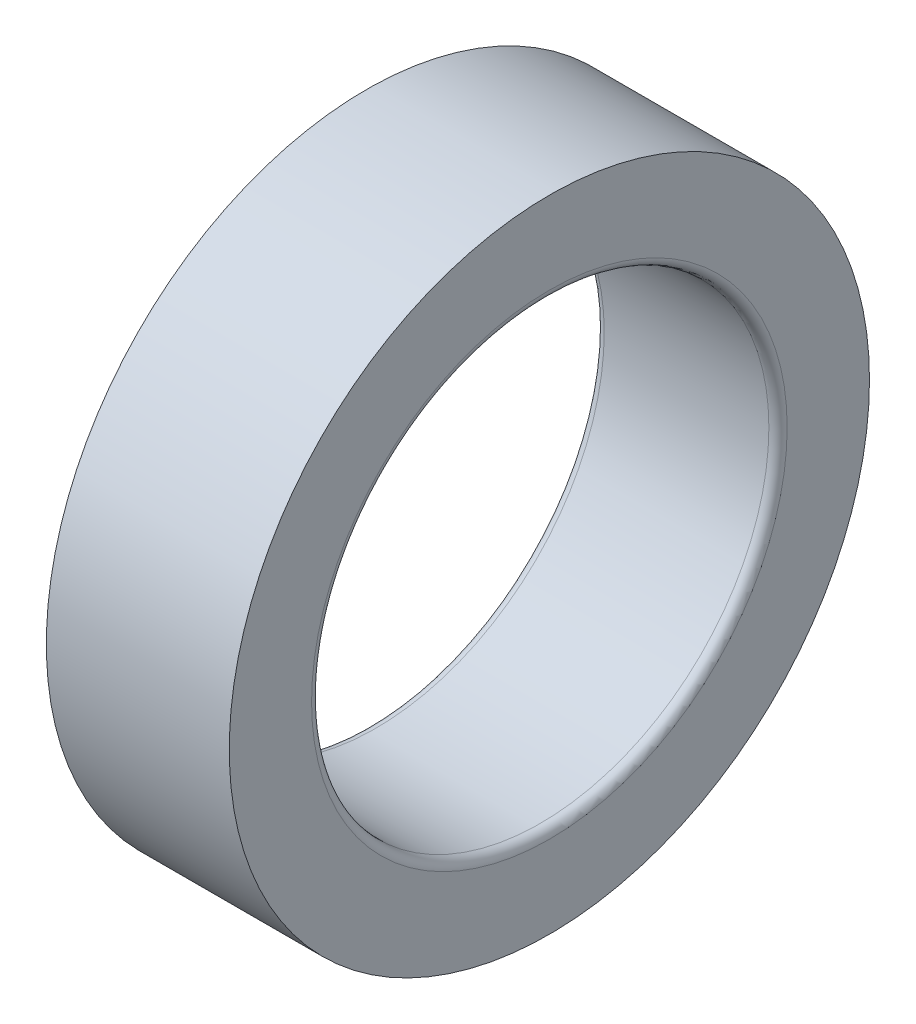
ISO-10303-21;
HEADER;
FILE_DESCRIPTION(('STEP AP214'),'2;1');
FILE_NAME('part.step','',(''),(''),'','','');
FILE_SCHEMA(('AUTOMOTIVE_DESIGN { 1 0 10303 214 1 1 1 1 }'));
ENDSEC;
DATA;
#1=APPLICATION_CONTEXT('core data for automotive mechanical design processes');
#2=APPLICATION_PROTOCOL_DEFINITION('international standard','automotive_design',2000,#1);
#3=PRODUCT_CONTEXT('',#1,'mechanical');
#4=PRODUCT('Part','Part','',(#3));
#5=PRODUCT_RELATED_PRODUCT_CATEGORY('part','',(#4));
#6=PRODUCT_DEFINITION_FORMATION('','',#4);
#7=PRODUCT_DEFINITION_CONTEXT('part definition',#1,'design');
#8=PRODUCT_DEFINITION('design','',#6,#7);
#9=PRODUCT_DEFINITION_SHAPE('','',#8);
#10=(LENGTH_UNIT() NAMED_UNIT(*) SI_UNIT(.MILLI.,.METRE.));
#11=(NAMED_UNIT(*) PLANE_ANGLE_UNIT() SI_UNIT($,.RADIAN.));
#12=(NAMED_UNIT(*) SI_UNIT($,.STERADIAN.) SOLID_ANGLE_UNIT());
#13=UNCERTAINTY_MEASURE_WITH_UNIT(LENGTH_MEASURE(1.E-05),#10,'distance_accuracy_value','');
#14=(GEOMETRIC_REPRESENTATION_CONTEXT(3) GLOBAL_UNCERTAINTY_ASSIGNED_CONTEXT((#13)) GLOBAL_UNIT_ASSIGNED_CONTEXT((#10,
#11,#12)) REPRESENTATION_CONTEXT('',''));
#15=CARTESIAN_POINT('',(0.,0.,0.));
#16=DIRECTION('',(0.,0.,1.));
#17=DIRECTION('',(1.,0.,0.));
#18=AXIS2_PLACEMENT_3D('',#15,#16,#17);
#19=CARTESIAN_POINT('',(20.,0.,0.));
#20=DIRECTION('',(1.,0.,0.));
#21=DIRECTION('',(0.,0.,-1.));
#22=AXIS2_PLACEMENT_3D('',#19,#20,#21);
#23=PLANE('',#22);
#24=CARTESIAN_POINT('',(20.,0.,0.));
#25=DIRECTION('',(1.,0.,0.));
#26=DIRECTION('',(0.,0.,-1.));
#27=AXIS2_PLACEMENT_3D('',#24,#25,#26);
#28=CIRCLE('',#27,26.);
#29=CARTESIAN_POINT('',(20.,0.,-26.));
#30=VERTEX_POINT('',#29);
#31=EDGE_CURVE('E10',#30,#30,#28,.F.);
#32=ORIENTED_EDGE('',*,*,#31,.T.);
#33=EDGE_LOOP('',(#32));
#34=FACE_BOUND('',#33,.T.);
#35=CARTESIAN_POINT('',(20.,0.,0.));
#36=DIRECTION('',(1.,0.,0.));
#37=DIRECTION('',(0.,0.,-1.));
#38=AXIS2_PLACEMENT_3D('',#35,#36,#37);
#39=CIRCLE('',#38,35.);
#40=CARTESIAN_POINT('',(20.,0.,-35.));
#41=VERTEX_POINT('',#40);
#42=EDGE_CURVE('E51',#41,#41,#39,.T.);
#43=ORIENTED_EDGE('',*,*,#42,.T.);
#44=EDGE_LOOP('',(#43));
#45=FACE_BOUND('',#44,.T.);
#46=ADVANCED_FACE('F31',(#34,#45),#23,.T.);
#47=CARTESIAN_POINT('',(0.,0.,0.));
#48=DIRECTION('',(1.,0.,0.));
#49=DIRECTION('',(0.,0.,-1.));
#50=AXIS2_PLACEMENT_3D('',#47,#48,#49);
#51=PLANE('',#50);
#52=CARTESIAN_POINT('',(0.,0.,0.));
#53=DIRECTION('',(1.,0.,0.));
#54=DIRECTION('',(0.,0.,-1.));
#55=AXIS2_PLACEMENT_3D('',#52,#53,#54);
#56=CIRCLE('',#55,26.);
#57=CARTESIAN_POINT('',(0.,0.,-26.));
#58=VERTEX_POINT('',#57);
#59=EDGE_CURVE('E46',#58,#58,#56,.T.);
#60=ORIENTED_EDGE('',*,*,#59,.T.);
#61=EDGE_LOOP('',(#60));
#62=FACE_BOUND('',#61,.T.);
#63=CARTESIAN_POINT('',(0.,0.,0.));
#64=DIRECTION('',(1.,0.,0.));
#65=DIRECTION('',(0.,0.,-1.));
#66=AXIS2_PLACEMENT_3D('',#63,#64,#65);
#67=CIRCLE('',#66,35.);
#68=CARTESIAN_POINT('',(0.,0.,-35.));
#69=VERTEX_POINT('',#68);
#70=EDGE_CURVE('E52',#69,#69,#67,.T.);
#71=ORIENTED_EDGE('',*,*,#70,.F.);
#72=EDGE_LOOP('',(#71));
#73=FACE_BOUND('',#72,.T.);
#74=ADVANCED_FACE('F63',(#62,#73),#51,.F.);
#75=CARTESIAN_POINT('',(20.,0.,0.));
#76=DIRECTION('',(-1.,0.,0.));
#77=DIRECTION('',(0.,0.,1.));
#78=AXIS2_PLACEMENT_3D('',#75,#76,#77);
#79=CYLINDRICAL_SURFACE('',#78,35.);
#80=ORIENTED_EDGE('',*,*,#42,.F.);
#81=EDGE_LOOP('',(#80));
#82=FACE_BOUND('',#81,.T.);
#83=ORIENTED_EDGE('',*,*,#70,.T.);
#84=EDGE_LOOP('',(#83));
#85=FACE_BOUND('',#84,.T.);
#86=ADVANCED_FACE('F59',(#82,#85),#79,.T.);
#87=CARTESIAN_POINT('',(20.,0.,0.));
#88=DIRECTION('',(-1.,0.,0.));
#89=DIRECTION('',(0.,0.,1.));
#90=AXIS2_PLACEMENT_3D('',#87,#88,#89);
#91=CYLINDRICAL_SURFACE('',#90,25.);
#92=CARTESIAN_POINT('',(1.,0.,0.));
#93=DIRECTION('',(1.,0.,0.));
#94=DIRECTION('',(0.,0.,-1.));
#95=AXIS2_PLACEMENT_3D('',#92,#93,#94);
#96=CIRCLE('',#95,25.);
#97=CARTESIAN_POINT('',(1.,0.,-25.));
#98=VERTEX_POINT('',#97);
#99=EDGE_CURVE('E38',#98,#98,#96,.F.);
#100=ORIENTED_EDGE('',*,*,#99,.T.);
#101=EDGE_LOOP('',(#100));
#102=FACE_BOUND('',#101,.T.);
#103=CARTESIAN_POINT('',(19.,0.,0.));
#104=DIRECTION('',(1.,0.,0.));
#105=DIRECTION('',(0.,0.,-1.));
#106=AXIS2_PLACEMENT_3D('',#103,#104,#105);
#107=CIRCLE('',#106,25.);
#108=CARTESIAN_POINT('',(19.,0.,-25.));
#109=VERTEX_POINT('',#108);
#110=EDGE_CURVE('E42',#109,#109,#107,.T.);
#111=ORIENTED_EDGE('',*,*,#110,.T.);
#112=EDGE_LOOP('',(#111));
#113=FACE_BOUND('',#112,.T.);
#114=ADVANCED_FACE('F62',(#102,#113),#91,.F.);
#115=CARTESIAN_POINT('',(1.,0.,0.));
#116=DIRECTION('',(1.,0.,0.));
#117=DIRECTION('',(0.,0.,-1.));
#118=AXIS2_PLACEMENT_3D('',#115,#116,#117);
#119=TOROIDAL_SURFACE('',#118,26.,1.);
#120=ORIENTED_EDGE('',*,*,#99,.F.);
#121=EDGE_LOOP('',(#120));
#122=FACE_BOUND('',#121,.T.);
#123=ORIENTED_EDGE('',*,*,#59,.F.);
#124=EDGE_LOOP('',(#123));
#125=FACE_BOUND('',#124,.T.);
#126=ADVANCED_FACE('F75',(#122,#125),#119,.T.);
#127=CARTESIAN_POINT('',(19.,0.,0.));
#128=DIRECTION('',(1.,0.,0.));
#129=DIRECTION('',(0.,0.,-1.));
#130=AXIS2_PLACEMENT_3D('',#127,#128,#129);
#131=TOROIDAL_SURFACE('',#130,26.,1.);
#132=ORIENTED_EDGE('',*,*,#31,.F.);
#133=EDGE_LOOP('',(#132));
#134=FACE_BOUND('',#133,.T.);
#135=ORIENTED_EDGE('',*,*,#110,.F.);
#136=EDGE_LOOP('',(#135));
#137=FACE_BOUND('',#136,.T.);
#138=ADVANCED_FACE('F33',(#134,#137),#131,.T.);
#139=CLOSED_SHELL('',(#46,#74,#86,#114,#126,#138));
#140=MANIFOLD_SOLID_BREP('B2',#139);
#141=ADVANCED_BREP_SHAPE_REPRESENTATION('',(#18,#140),#14);
#142=SHAPE_DEFINITION_REPRESENTATION(#9,#141);
ENDSEC;
END-ISO-10303-21;
